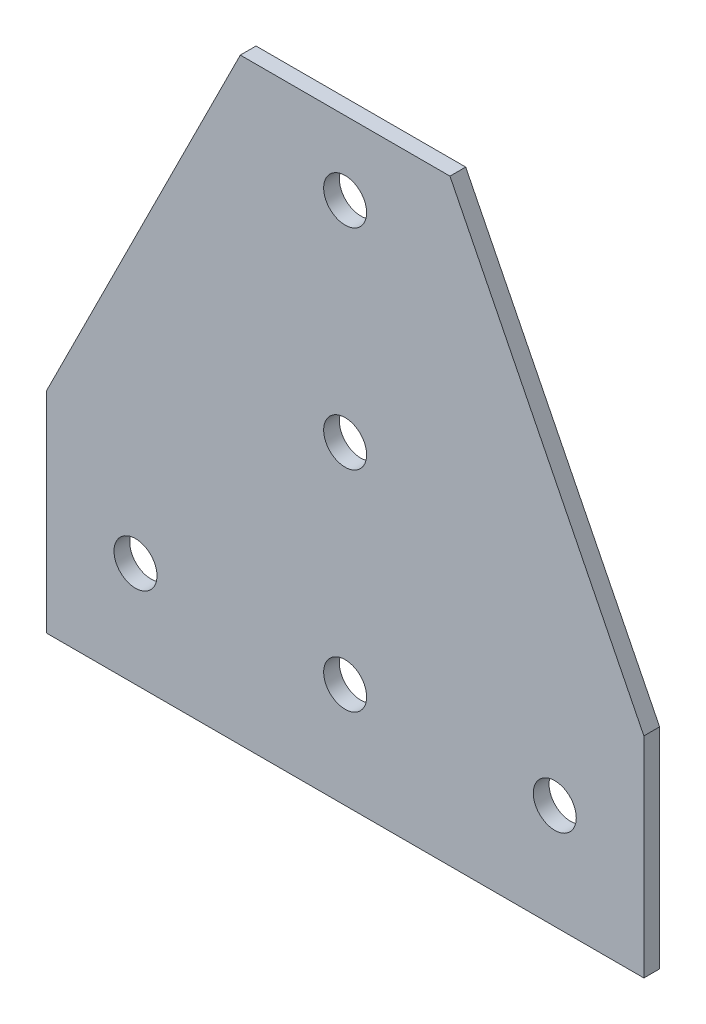
ISO-10303-21;
HEADER;
FILE_DESCRIPTION(('STEP AP214'),'2;1');
FILE_NAME('part.step','',(''),(''),'','','');
FILE_SCHEMA(('AUTOMOTIVE_DESIGN { 1 0 10303 214 1 1 1 1 }'));
ENDSEC;
DATA;
#1=APPLICATION_CONTEXT('core data for automotive mechanical design processes');
#2=APPLICATION_PROTOCOL_DEFINITION('international standard','automotive_design',2000,#1);
#3=PRODUCT_CONTEXT('',#1,'mechanical');
#4=PRODUCT('Part','Part','',(#3));
#5=PRODUCT_RELATED_PRODUCT_CATEGORY('part','',(#4));
#6=PRODUCT_DEFINITION_FORMATION('','',#4);
#7=PRODUCT_DEFINITION_CONTEXT('part definition',#1,'design');
#8=PRODUCT_DEFINITION('design','',#6,#7);
#9=PRODUCT_DEFINITION_SHAPE('','',#8);
#10=(LENGTH_UNIT() NAMED_UNIT(*) SI_UNIT(.MILLI.,.METRE.));
#11=(NAMED_UNIT(*) PLANE_ANGLE_UNIT() SI_UNIT($,.RADIAN.));
#12=(NAMED_UNIT(*) SI_UNIT($,.STERADIAN.) SOLID_ANGLE_UNIT());
#13=UNCERTAINTY_MEASURE_WITH_UNIT(LENGTH_MEASURE(1.E-05),#10,'distance_accuracy_value','');
#14=(GEOMETRIC_REPRESENTATION_CONTEXT(3) GLOBAL_UNCERTAINTY_ASSIGNED_CONTEXT((#13)) GLOBAL_UNIT_ASSIGNED_CONTEXT((#10,
#11,#12)) REPRESENTATION_CONTEXT('',''));
#15=CARTESIAN_POINT('',(0.,0.,0.));
#16=DIRECTION('',(0.,0.,1.));
#17=DIRECTION('',(1.,0.,0.));
#18=AXIS2_PLACEMENT_3D('',#15,#16,#17);
#19=CARTESIAN_POINT('',(0.,0.,1.5));
#20=DIRECTION('',(0.,0.,1.));
#21=DIRECTION('',(1.,0.,0.));
#22=AXIS2_PLACEMENT_3D('',#19,#20,#21);
#23=PLANE('',#22);
#24=CARTESIAN_POINT('',(0.,40.,1.5));
#25=DIRECTION('',(0.,0.,1.));
#26=DIRECTION('',(1.,0.,0.));
#27=AXIS2_PLACEMENT_3D('',#24,#25,#26);
#28=CIRCLE('',#27,4.1);
#29=CARTESIAN_POINT('',(4.1,40.,1.5));
#30=VERTEX_POINT('',#29);
#31=EDGE_CURVE('E196',#30,#30,#28,.T.);
#32=ORIENTED_EDGE('',*,*,#31,.F.);
#33=EDGE_LOOP('',(#32));
#34=FACE_BOUND('',#33,.T.);
#35=CARTESIAN_POINT('',(-40.,0.,1.5));
#36=DIRECTION('',(0.,0.,1.));
#37=DIRECTION('',(1.,0.,0.));
#38=AXIS2_PLACEMENT_3D('',#35,#36,#37);
#39=CIRCLE('',#38,4.1);
#40=CARTESIAN_POINT('',(-35.9,0.,1.5));
#41=VERTEX_POINT('',#40);
#42=EDGE_CURVE('E208',#41,#41,#39,.T.);
#43=ORIENTED_EDGE('',*,*,#42,.F.);
#44=EDGE_LOOP('',(#43));
#45=FACE_BOUND('',#44,.T.);
#46=DIRECTION('',(0.,-1.,0.));
#47=VECTOR('',#46,1.);
#48=CARTESIAN_POINT('',(-57.,20.,1.5));
#49=LINE('',#48,#47);
#50=CARTESIAN_POINT('',(-57.,20.,1.5));
#51=VERTEX_POINT('',#50);
#52=CARTESIAN_POINT('',(-57.,-20.,1.5));
#53=VERTEX_POINT('',#52);
#54=EDGE_CURVE('E132',#51,#53,#49,.T.);
#55=ORIENTED_EDGE('',*,*,#54,.T.);
#56=DIRECTION('',(1.,0.,0.));
#57=VECTOR('',#56,1.);
#58=CARTESIAN_POINT('',(-57.,-20.,1.5));
#59=LINE('',#58,#57);
#60=CARTESIAN_POINT('',(57.,-20.,1.5));
#61=VERTEX_POINT('',#60);
#62=EDGE_CURVE('E90',#53,#61,#59,.T.);
#63=ORIENTED_EDGE('',*,*,#62,.T.);
#64=DIRECTION('',(0.,1.,0.));
#65=VECTOR('',#64,1.);
#66=CARTESIAN_POINT('',(57.,-20.,1.5));
#67=LINE('',#66,#65);
#68=CARTESIAN_POINT('',(57.,20.,1.5));
#69=VERTEX_POINT('',#68);
#70=EDGE_CURVE('E103',#61,#69,#67,.T.);
#71=ORIENTED_EDGE('',*,*,#70,.T.);
#72=DIRECTION('',(-0.447213595499958,0.894427190999916,0.));
#73=VECTOR('',#72,1.);
#74=CARTESIAN_POINT('',(57.,20.,1.5));
#75=LINE('',#74,#73);
#76=CARTESIAN_POINT('',(20.,94.,1.5));
#77=VERTEX_POINT('',#76);
#78=EDGE_CURVE('E97',#69,#77,#75,.T.);
#79=ORIENTED_EDGE('',*,*,#78,.T.);
#80=DIRECTION('',(-1.,0.,0.));
#81=VECTOR('',#80,1.);
#82=CARTESIAN_POINT('',(20.,94.,1.5));
#83=LINE('',#82,#81);
#84=CARTESIAN_POINT('',(-20.,94.,1.5));
#85=VERTEX_POINT('',#84);
#86=EDGE_CURVE('E101',#77,#85,#83,.T.);
#87=ORIENTED_EDGE('',*,*,#86,.T.);
#88=DIRECTION('',(-0.447213595499958,-0.894427190999916,0.));
#89=VECTOR('',#88,1.);
#90=CARTESIAN_POINT('',(-20.,94.,1.5));
#91=LINE('',#90,#89);
#92=EDGE_CURVE('E53',#85,#51,#91,.T.);
#93=ORIENTED_EDGE('',*,*,#92,.T.);
#94=EDGE_LOOP('',(#55,#63,#71,#79,#87,#93));
#95=FACE_BOUND('',#94,.T.);
#96=CARTESIAN_POINT('',(0.,0.,1.5));
#97=DIRECTION('',(0.,0.,1.));
#98=DIRECTION('',(1.,0.,0.));
#99=AXIS2_PLACEMENT_3D('',#96,#97,#98);
#100=CIRCLE('',#99,4.1);
#101=CARTESIAN_POINT('',(4.1,0.,1.5));
#102=VERTEX_POINT('',#101);
#103=EDGE_CURVE('E125',#102,#102,#100,.T.);
#104=ORIENTED_EDGE('',*,*,#103,.F.);
#105=EDGE_LOOP('',(#104));
#106=FACE_BOUND('',#105,.T.);
#107=CARTESIAN_POINT('',(40.,0.,1.5));
#108=DIRECTION('',(0.,0.,1.));
#109=DIRECTION('',(1.,0.,0.));
#110=AXIS2_PLACEMENT_3D('',#107,#108,#109);
#111=CIRCLE('',#110,4.1);
#112=CARTESIAN_POINT('',(44.1,0.,1.5));
#113=VERTEX_POINT('',#112);
#114=EDGE_CURVE('E202',#113,#113,#111,.T.);
#115=ORIENTED_EDGE('',*,*,#114,.F.);
#116=EDGE_LOOP('',(#115));
#117=FACE_BOUND('',#116,.T.);
#118=CARTESIAN_POINT('',(0.,80.,1.5));
#119=DIRECTION('',(0.,0.,1.));
#120=DIRECTION('',(1.,0.,0.));
#121=AXIS2_PLACEMENT_3D('',#118,#119,#120);
#122=CIRCLE('',#121,4.1);
#123=CARTESIAN_POINT('',(4.1,80.,1.5));
#124=VERTEX_POINT('',#123);
#125=EDGE_CURVE('E187',#124,#124,#122,.T.);
#126=ORIENTED_EDGE('',*,*,#125,.F.);
#127=EDGE_LOOP('',(#126));
#128=FACE_BOUND('',#127,.T.);
#129=ADVANCED_FACE('F36',(#34,#45,#95,#106,#117,#128),#23,.T.);
#130=CARTESIAN_POINT('',(0.,0.,-1.5));
#131=DIRECTION('',(0.,0.,1.));
#132=DIRECTION('',(1.,0.,0.));
#133=AXIS2_PLACEMENT_3D('',#130,#131,#132);
#134=PLANE('',#133);
#135=DIRECTION('',(0.,-1.,0.));
#136=VECTOR('',#135,1.);
#137=CARTESIAN_POINT('',(-57.,20.,-1.5));
#138=LINE('',#137,#136);
#139=CARTESIAN_POINT('',(-57.,20.,-1.5));
#140=VERTEX_POINT('',#139);
#141=CARTESIAN_POINT('',(-57.,-20.,-1.5));
#142=VERTEX_POINT('',#141);
#143=EDGE_CURVE('E121',#140,#142,#138,.T.);
#144=ORIENTED_EDGE('',*,*,#143,.F.);
#145=DIRECTION('',(-0.447213595499958,-0.894427190999916,0.));
#146=VECTOR('',#145,1.);
#147=CARTESIAN_POINT('',(-20.,94.,-1.5));
#148=LINE('',#147,#146);
#149=CARTESIAN_POINT('',(-20.,94.,-1.5));
#150=VERTEX_POINT('',#149);
#151=EDGE_CURVE('E82',#150,#140,#148,.T.);
#152=ORIENTED_EDGE('',*,*,#151,.F.);
#153=DIRECTION('',(-1.,0.,0.));
#154=VECTOR('',#153,1.);
#155=CARTESIAN_POINT('',(20.,94.,-1.5));
#156=LINE('',#155,#154);
#157=CARTESIAN_POINT('',(20.,94.,-1.5));
#158=VERTEX_POINT('',#157);
#159=EDGE_CURVE('E76',#158,#150,#156,.T.);
#160=ORIENTED_EDGE('',*,*,#159,.F.);
#161=DIRECTION('',(-0.447213595499958,0.894427190999916,0.));
#162=VECTOR('',#161,1.);
#163=CARTESIAN_POINT('',(57.,20.,-1.5));
#164=LINE('',#163,#162);
#165=CARTESIAN_POINT('',(57.,20.,-1.5));
#166=VERTEX_POINT('',#165);
#167=EDGE_CURVE('E111',#166,#158,#164,.T.);
#168=ORIENTED_EDGE('',*,*,#167,.F.);
#169=DIRECTION('',(0.,1.,0.));
#170=VECTOR('',#169,1.);
#171=CARTESIAN_POINT('',(57.,-20.,-1.5));
#172=LINE('',#171,#170);
#173=CARTESIAN_POINT('',(57.,-20.,-1.5));
#174=VERTEX_POINT('',#173);
#175=EDGE_CURVE('E127',#174,#166,#172,.T.);
#176=ORIENTED_EDGE('',*,*,#175,.F.);
#177=DIRECTION('',(1.,0.,0.));
#178=VECTOR('',#177,1.);
#179=CARTESIAN_POINT('',(-57.,-20.,-1.5));
#180=LINE('',#179,#178);
#181=EDGE_CURVE('E124',#142,#174,#180,.T.);
#182=ORIENTED_EDGE('',*,*,#181,.F.);
#183=EDGE_LOOP('',(#144,#152,#160,#168,#176,#182));
#184=FACE_BOUND('',#183,.T.);
#185=CARTESIAN_POINT('',(0.,0.,-1.5));
#186=DIRECTION('',(0.,0.,1.));
#187=DIRECTION('',(1.,0.,0.));
#188=AXIS2_PLACEMENT_3D('',#185,#186,#187);
#189=CIRCLE('',#188,4.1);
#190=CARTESIAN_POINT('',(4.1,0.,-1.5));
#191=VERTEX_POINT('',#190);
#192=EDGE_CURVE('E211',#191,#191,#189,.T.);
#193=ORIENTED_EDGE('',*,*,#192,.T.);
#194=EDGE_LOOP('',(#193));
#195=FACE_BOUND('',#194,.T.);
#196=CARTESIAN_POINT('',(-40.,0.,-1.5));
#197=DIRECTION('',(0.,0.,1.));
#198=DIRECTION('',(1.,0.,0.));
#199=AXIS2_PLACEMENT_3D('',#196,#197,#198);
#200=CIRCLE('',#199,4.1);
#201=CARTESIAN_POINT('',(-35.9,0.,-1.5));
#202=VERTEX_POINT('',#201);
#203=EDGE_CURVE('E205',#202,#202,#200,.T.);
#204=ORIENTED_EDGE('',*,*,#203,.T.);
#205=EDGE_LOOP('',(#204));
#206=FACE_BOUND('',#205,.T.);
#207=CARTESIAN_POINT('',(40.,0.,-1.5));
#208=DIRECTION('',(0.,0.,1.));
#209=DIRECTION('',(1.,0.,0.));
#210=AXIS2_PLACEMENT_3D('',#207,#208,#209);
#211=CIRCLE('',#210,4.1);
#212=CARTESIAN_POINT('',(44.1,0.,-1.5));
#213=VERTEX_POINT('',#212);
#214=EDGE_CURVE('E199',#213,#213,#211,.T.);
#215=ORIENTED_EDGE('',*,*,#214,.T.);
#216=EDGE_LOOP('',(#215));
#217=FACE_BOUND('',#216,.T.);
#218=CARTESIAN_POINT('',(0.,40.,-1.5));
#219=DIRECTION('',(0.,0.,1.));
#220=DIRECTION('',(1.,0.,0.));
#221=AXIS2_PLACEMENT_3D('',#218,#219,#220);
#222=CIRCLE('',#221,4.1);
#223=CARTESIAN_POINT('',(4.1,40.,-1.5));
#224=VERTEX_POINT('',#223);
#225=EDGE_CURVE('E193',#224,#224,#222,.T.);
#226=ORIENTED_EDGE('',*,*,#225,.T.);
#227=EDGE_LOOP('',(#226));
#228=FACE_BOUND('',#227,.T.);
#229=CARTESIAN_POINT('',(0.,80.,-1.5));
#230=DIRECTION('',(0.,0.,1.));
#231=DIRECTION('',(1.,0.,0.));
#232=AXIS2_PLACEMENT_3D('',#229,#230,#231);
#233=CIRCLE('',#232,4.1);
#234=CARTESIAN_POINT('',(4.1,80.,-1.5));
#235=VERTEX_POINT('',#234);
#236=EDGE_CURVE('E190',#235,#235,#233,.T.);
#237=ORIENTED_EDGE('',*,*,#236,.T.);
#238=EDGE_LOOP('',(#237));
#239=FACE_BOUND('',#238,.T.);
#240=ADVANCED_FACE('F141',(#184,#195,#206,#217,#228,#239),#134,.F.);
#241=CARTESIAN_POINT('',(-57.,20.,1.5));
#242=DIRECTION('',(1.,0.,0.));
#243=DIRECTION('',(0.,0.,-1.));
#244=AXIS2_PLACEMENT_3D('',#241,#242,#243);
#245=PLANE('',#244);
#246=ORIENTED_EDGE('',*,*,#143,.T.);
#247=DIRECTION('',(0.,0.,-1.));
#248=VECTOR('',#247,1.);
#249=CARTESIAN_POINT('',(-57.,-20.,1.5));
#250=LINE('',#249,#248);
#251=EDGE_CURVE('E11',#53,#142,#250,.T.);
#252=ORIENTED_EDGE('',*,*,#251,.F.);
#253=ORIENTED_EDGE('',*,*,#54,.F.);
#254=DIRECTION('',(0.,0.,-1.));
#255=VECTOR('',#254,1.);
#256=CARTESIAN_POINT('',(-57.,20.,1.5));
#257=LINE('',#256,#255);
#258=EDGE_CURVE('E117',#51,#140,#257,.T.);
#259=ORIENTED_EDGE('',*,*,#258,.T.);
#260=EDGE_LOOP('',(#246,#252,#253,#259));
#261=FACE_BOUND('',#260,.T.);
#262=ADVANCED_FACE('F38',(#261),#245,.F.);
#263=CARTESIAN_POINT('',(-57.,-20.,1.5));
#264=DIRECTION('',(0.,1.,0.));
#265=DIRECTION('',(0.,0.,1.));
#266=AXIS2_PLACEMENT_3D('',#263,#264,#265);
#267=PLANE('',#266);
#268=ORIENTED_EDGE('',*,*,#181,.T.);
#269=DIRECTION('',(0.,0.,-1.));
#270=VECTOR('',#269,1.);
#271=CARTESIAN_POINT('',(57.,-20.,1.5));
#272=LINE('',#271,#270);
#273=EDGE_CURVE('E45',#61,#174,#272,.T.);
#274=ORIENTED_EDGE('',*,*,#273,.F.);
#275=ORIENTED_EDGE('',*,*,#62,.F.);
#276=ORIENTED_EDGE('',*,*,#251,.T.);
#277=EDGE_LOOP('',(#268,#274,#275,#276));
#278=FACE_BOUND('',#277,.T.);
#279=ADVANCED_FACE('F278',(#278),#267,.F.);
#280=CARTESIAN_POINT('',(57.,-20.,1.5));
#281=DIRECTION('',(-1.,0.,0.));
#282=DIRECTION('',(0.,0.,1.));
#283=AXIS2_PLACEMENT_3D('',#280,#281,#282);
#284=PLANE('',#283);
#285=ORIENTED_EDGE('',*,*,#175,.T.);
#286=DIRECTION('',(0.,0.,-1.));
#287=VECTOR('',#286,1.);
#288=CARTESIAN_POINT('',(57.,20.,1.5));
#289=LINE('',#288,#287);
#290=EDGE_CURVE('E112',#69,#166,#289,.T.);
#291=ORIENTED_EDGE('',*,*,#290,.F.);
#292=ORIENTED_EDGE('',*,*,#70,.F.);
#293=ORIENTED_EDGE('',*,*,#273,.T.);
#294=EDGE_LOOP('',(#285,#291,#292,#293));
#295=FACE_BOUND('',#294,.T.);
#296=ADVANCED_FACE('F138',(#295),#284,.F.);
#297=CARTESIAN_POINT('',(57.,20.,1.5));
#298=DIRECTION('',(-0.894427190999916,-0.447213595499958,0.));
#299=DIRECTION('',(0.447213595499958,-0.894427190999916,0.));
#300=AXIS2_PLACEMENT_3D('',#297,#298,#299);
#301=PLANE('',#300);
#302=ORIENTED_EDGE('',*,*,#167,.T.);
#303=DIRECTION('',(0.,0.,-1.));
#304=VECTOR('',#303,1.);
#305=CARTESIAN_POINT('',(20.,94.,1.5));
#306=LINE('',#305,#304);
#307=EDGE_CURVE('E108',#77,#158,#306,.T.);
#308=ORIENTED_EDGE('',*,*,#307,.F.);
#309=ORIENTED_EDGE('',*,*,#78,.F.);
#310=ORIENTED_EDGE('',*,*,#290,.T.);
#311=EDGE_LOOP('',(#302,#308,#309,#310));
#312=FACE_BOUND('',#311,.T.);
#313=ADVANCED_FACE('F109',(#312),#301,.F.);
#314=CARTESIAN_POINT('',(20.,94.,1.5));
#315=DIRECTION('',(0.,-1.,0.));
#316=DIRECTION('',(0.,0.,-1.));
#317=AXIS2_PLACEMENT_3D('',#314,#315,#316);
#318=PLANE('',#317);
#319=ORIENTED_EDGE('',*,*,#159,.T.);
#320=DIRECTION('',(0.,0.,-1.));
#321=VECTOR('',#320,1.);
#322=CARTESIAN_POINT('',(-20.,94.,1.5));
#323=LINE('',#322,#321);
#324=EDGE_CURVE('E113',#85,#150,#323,.T.);
#325=ORIENTED_EDGE('',*,*,#324,.F.);
#326=ORIENTED_EDGE('',*,*,#86,.F.);
#327=ORIENTED_EDGE('',*,*,#307,.T.);
#328=EDGE_LOOP('',(#319,#325,#326,#327));
#329=FACE_BOUND('',#328,.T.);
#330=ADVANCED_FACE('F115',(#329),#318,.F.);
#331=CARTESIAN_POINT('',(-20.,94.,1.5));
#332=DIRECTION('',(0.894427190999916,-0.447213595499958,0.));
#333=DIRECTION('',(0.447213595499958,0.894427190999916,0.));
#334=AXIS2_PLACEMENT_3D('',#331,#332,#333);
#335=PLANE('',#334);
#336=ORIENTED_EDGE('',*,*,#151,.T.);
#337=ORIENTED_EDGE('',*,*,#258,.F.);
#338=ORIENTED_EDGE('',*,*,#92,.F.);
#339=ORIENTED_EDGE('',*,*,#324,.T.);
#340=EDGE_LOOP('',(#336,#337,#338,#339));
#341=FACE_BOUND('',#340,.T.);
#342=ADVANCED_FACE('F146',(#341),#335,.F.);
#343=CARTESIAN_POINT('',(0.,0.,1.5));
#344=DIRECTION('',(0.,0.,-1.));
#345=DIRECTION('',(-1.,0.,0.));
#346=AXIS2_PLACEMENT_3D('',#343,#344,#345);
#347=CYLINDRICAL_SURFACE('',#346,4.1);
#348=ORIENTED_EDGE('',*,*,#103,.T.);
#349=EDGE_LOOP('',(#348));
#350=FACE_BOUND('',#349,.T.);
#351=ORIENTED_EDGE('',*,*,#192,.F.);
#352=EDGE_LOOP('',(#351));
#353=FACE_BOUND('',#352,.T.);
#354=ADVANCED_FACE('F148',(#350,#353),#347,.F.);
#355=CARTESIAN_POINT('',(-40.,0.,1.5));
#356=DIRECTION('',(0.,0.,-1.));
#357=DIRECTION('',(-1.,0.,0.));
#358=AXIS2_PLACEMENT_3D('',#355,#356,#357);
#359=CYLINDRICAL_SURFACE('',#358,4.1);
#360=ORIENTED_EDGE('',*,*,#42,.T.);
#361=EDGE_LOOP('',(#360));
#362=FACE_BOUND('',#361,.T.);
#363=ORIENTED_EDGE('',*,*,#203,.F.);
#364=EDGE_LOOP('',(#363));
#365=FACE_BOUND('',#364,.T.);
#366=ADVANCED_FACE('F154',(#362,#365),#359,.F.);
#367=CARTESIAN_POINT('',(40.,0.,1.5));
#368=DIRECTION('',(0.,0.,-1.));
#369=DIRECTION('',(-1.,0.,0.));
#370=AXIS2_PLACEMENT_3D('',#367,#368,#369);
#371=CYLINDRICAL_SURFACE('',#370,4.1);
#372=ORIENTED_EDGE('',*,*,#114,.T.);
#373=EDGE_LOOP('',(#372));
#374=FACE_BOUND('',#373,.T.);
#375=ORIENTED_EDGE('',*,*,#214,.F.);
#376=EDGE_LOOP('',(#375));
#377=FACE_BOUND('',#376,.T.);
#378=ADVANCED_FACE('F170',(#374,#377),#371,.F.);
#379=CARTESIAN_POINT('',(0.,40.,1.5));
#380=DIRECTION('',(0.,0.,-1.));
#381=DIRECTION('',(-1.,0.,0.));
#382=AXIS2_PLACEMENT_3D('',#379,#380,#381);
#383=CYLINDRICAL_SURFACE('',#382,4.1);
#384=ORIENTED_EDGE('',*,*,#31,.T.);
#385=EDGE_LOOP('',(#384));
#386=FACE_BOUND('',#385,.T.);
#387=ORIENTED_EDGE('',*,*,#225,.F.);
#388=EDGE_LOOP('',(#387));
#389=FACE_BOUND('',#388,.T.);
#390=ADVANCED_FACE('F174',(#386,#389),#383,.F.);
#391=CARTESIAN_POINT('',(0.,80.,1.5));
#392=DIRECTION('',(0.,0.,-1.));
#393=DIRECTION('',(-1.,0.,0.));
#394=AXIS2_PLACEMENT_3D('',#391,#392,#393);
#395=CYLINDRICAL_SURFACE('',#394,4.1);
#396=ORIENTED_EDGE('',*,*,#125,.T.);
#397=EDGE_LOOP('',(#396));
#398=FACE_BOUND('',#397,.T.);
#399=ORIENTED_EDGE('',*,*,#236,.F.);
#400=EDGE_LOOP('',(#399));
#401=FACE_BOUND('',#400,.T.);
#402=ADVANCED_FACE('F178',(#398,#401),#395,.F.);
#403=CLOSED_SHELL('',(#129,#240,#262,#279,#296,#313,#330,#342,#354,#366,#378,#390,#402));
#404=MANIFOLD_SOLID_BREP('B2',#403);
#405=ADVANCED_BREP_SHAPE_REPRESENTATION('',(#18,#404),#14);
#406=SHAPE_DEFINITION_REPRESENTATION(#9,#405);
ENDSEC;
END-ISO-10303-21;
